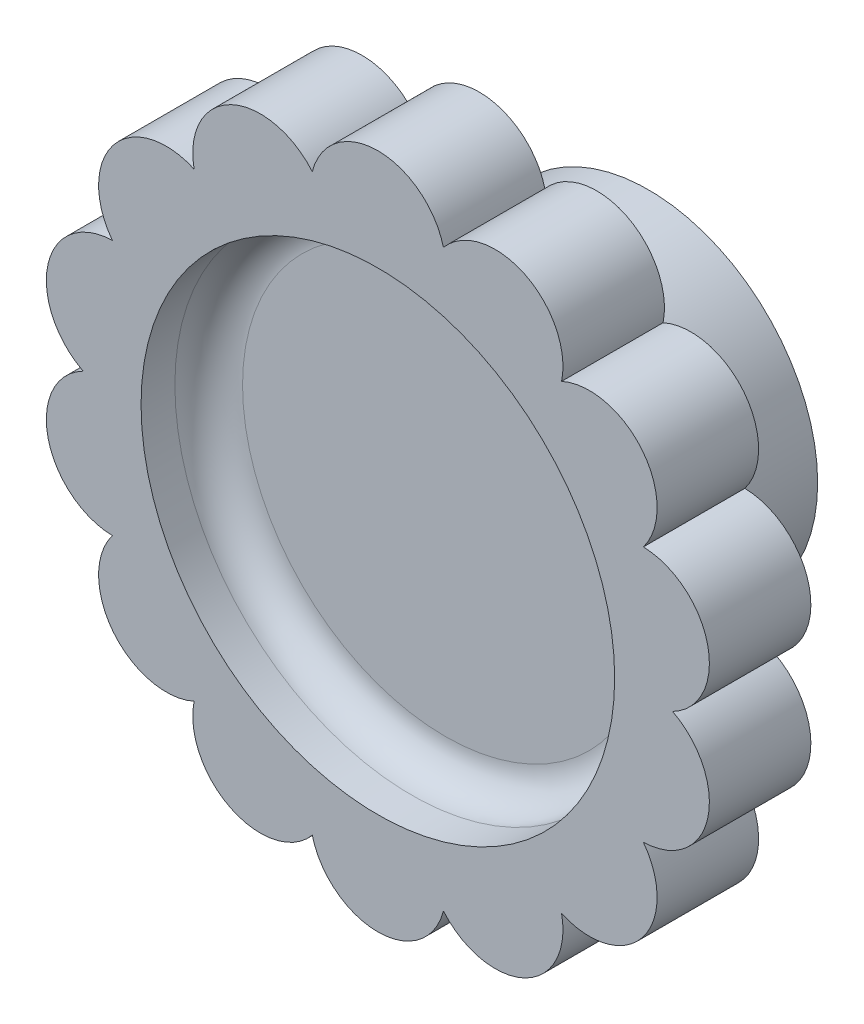
ISO-10303-21;
HEADER;
FILE_DESCRIPTION(('STEP AP214'),'2;1');
FILE_NAME('part.step','',(''),(''),'','','');
FILE_SCHEMA(('AUTOMOTIVE_DESIGN { 1 0 10303 214 1 1 1 1 }'));
ENDSEC;
DATA;
#1=APPLICATION_CONTEXT('core data for automotive mechanical design processes');
#2=APPLICATION_PROTOCOL_DEFINITION('international standard','automotive_design',2000,#1);
#3=PRODUCT_CONTEXT('',#1,'mechanical');
#4=PRODUCT('Part','Part','',(#3));
#5=PRODUCT_RELATED_PRODUCT_CATEGORY('part','',(#4));
#6=PRODUCT_DEFINITION_FORMATION('','',#4);
#7=PRODUCT_DEFINITION_CONTEXT('part definition',#1,'design');
#8=PRODUCT_DEFINITION('design','',#6,#7);
#9=PRODUCT_DEFINITION_SHAPE('','',#8);
#10=(LENGTH_UNIT() NAMED_UNIT(*) SI_UNIT(.MILLI.,.METRE.));
#11=(NAMED_UNIT(*) PLANE_ANGLE_UNIT() SI_UNIT($,.RADIAN.));
#12=(NAMED_UNIT(*) SI_UNIT($,.STERADIAN.) SOLID_ANGLE_UNIT());
#13=UNCERTAINTY_MEASURE_WITH_UNIT(LENGTH_MEASURE(1.E-05),#10,'distance_accuracy_value','');
#14=(GEOMETRIC_REPRESENTATION_CONTEXT(3) GLOBAL_UNCERTAINTY_ASSIGNED_CONTEXT((#13)) GLOBAL_UNIT_ASSIGNED_CONTEXT((#10,
#11,#12)) REPRESENTATION_CONTEXT('',''));
#15=CARTESIAN_POINT('',(0.,0.,0.));
#16=DIRECTION('',(0.,0.,1.));
#17=DIRECTION('',(1.,0.,0.));
#18=AXIS2_PLACEMENT_3D('',#15,#16,#17);
#19=CARTESIAN_POINT('',(0.,0.,0.));
#20=DIRECTION('',(0.,0.,1.));
#21=DIRECTION('',(1.,0.,0.));
#22=AXIS2_PLACEMENT_3D('',#19,#20,#21);
#23=PLANE('',#22);
#24=CARTESIAN_POINT('',(0.,0.,0.));
#25=DIRECTION('',(0.,0.,1.));
#26=DIRECTION('',(1.,0.,0.));
#27=AXIS2_PLACEMENT_3D('',#24,#25,#26);
#28=CIRCLE('',#27,10.);
#29=CARTESIAN_POINT('',(10.,0.,0.));
#30=VERTEX_POINT('',#29);
#31=EDGE_CURVE('E233',#30,#30,#28,.T.);
#32=ORIENTED_EDGE('',*,*,#31,.F.);
#33=EDGE_LOOP('',(#32));
#34=FACE_BOUND('',#33,.T.);
#35=CARTESIAN_POINT('',(0.,0.,0.));
#36=DIRECTION('',(0.,0.,1.));
#37=DIRECTION('',(1.,0.,0.));
#38=AXIS2_PLACEMENT_3D('',#35,#36,#37);
#39=CIRCLE('',#38,8.);
#40=CARTESIAN_POINT('',(8.,0.,0.));
#41=VERTEX_POINT('',#40);
#42=EDGE_CURVE('E230',#41,#41,#39,.T.);
#43=ORIENTED_EDGE('',*,*,#42,.T.);
#44=EDGE_LOOP('',(#43));
#45=FACE_BOUND('',#44,.T.);
#46=ADVANCED_FACE('F33',(#34,#45),#23,.F.);
#47=CARTESIAN_POINT('',(0.,0.,10.));
#48=DIRECTION('',(0.,0.,-1.));
#49=DIRECTION('',(-1.,0.,0.));
#50=AXIS2_PLACEMENT_3D('',#47,#48,#49);
#51=CYLINDRICAL_SURFACE('',#50,10.);
#52=CARTESIAN_POINT('',(0.,0.,10.));
#53=DIRECTION('',(0.,0.,1.));
#54=DIRECTION('',(1.,0.,0.));
#55=AXIS2_PLACEMENT_3D('',#52,#53,#54);
#56=CIRCLE('',#55,10.);
#57=CARTESIAN_POINT('',(10.,0.,10.));
#58=VERTEX_POINT('',#57);
#59=EDGE_CURVE('E234',#58,#58,#56,.T.);
#60=ORIENTED_EDGE('',*,*,#59,.F.);
#61=EDGE_LOOP('',(#60));
#62=FACE_BOUND('',#61,.T.);
#63=ORIENTED_EDGE('',*,*,#31,.T.);
#64=EDGE_LOOP('',(#63));
#65=FACE_BOUND('',#64,.T.);
#66=ADVANCED_FACE('F252',(#62,#65),#51,.T.);
#67=CARTESIAN_POINT('',(0.,0.,10.));
#68=DIRECTION('',(0.,0.,-1.));
#69=DIRECTION('',(-1.,0.,0.));
#70=AXIS2_PLACEMENT_3D('',#67,#68,#69);
#71=CYLINDRICAL_SURFACE('',#70,8.);
#72=CARTESIAN_POINT('',(0.,0.,10.));
#73=DIRECTION('',(0.,0.,1.));
#74=DIRECTION('',(1.,0.,0.));
#75=AXIS2_PLACEMENT_3D('',#72,#73,#74);
#76=CIRCLE('',#75,8.);
#77=CARTESIAN_POINT('',(8.,0.,10.));
#78=VERTEX_POINT('',#77);
#79=EDGE_CURVE('E227',#78,#78,#76,.T.);
#80=ORIENTED_EDGE('',*,*,#79,.T.);
#81=EDGE_LOOP('',(#80));
#82=FACE_BOUND('',#81,.T.);
#83=ORIENTED_EDGE('',*,*,#42,.F.);
#84=EDGE_LOOP('',(#83));
#85=FACE_BOUND('',#84,.T.);
#86=ADVANCED_FACE('F258',(#82,#85),#71,.F.);
#87=CARTESIAN_POINT('',(-9.72572177268423,12.1956693580884,10.));
#88=DIRECTION('',(0.,0.,1.));
#89=DIRECTION('',(1.,0.,0.));
#90=AXIS2_PLACEMENT_3D('',#87,#88,#89);
#91=PLANE('',#90);
#92=ORIENTED_EDGE('',*,*,#79,.F.);
#93=EDGE_LOOP('',(#92));
#94=FACE_BOUND('',#93,.T.);
#95=ADVANCED_FACE('F265',(#94),#91,.F.);
#96=CARTESIAN_POINT('',(-6.94213982588066,14.4155018864375,16.));
#97=DIRECTION('',(0.,0.,-1.));
#98=DIRECTION('',(-1.,0.,0.));
#99=AXIS2_PLACEMENT_3D('',#96,#97,#98);
#100=CYLINDRICAL_SURFACE('',#99,3.9999999999992);
#101=CARTESIAN_POINT('',(-6.94213982588066,14.4155018864375,10.));
#102=DIRECTION('',(0.,0.,1.));
#103=DIRECTION('',(1.,0.,0.));
#104=AXIS2_PLACEMENT_3D('',#101,#102,#103);
#105=CIRCLE('',#104,3.9999999999992);
#106=CARTESIAN_POINT('',(-3.87676744659127,16.9852279761766,10.));
#107=VERTEX_POINT('',#106);
#108=CARTESIAN_POINT('',(-10.862461001544,13.6210952653441,10.));
#109=VERTEX_POINT('',#108);
#110=EDGE_CURVE('E167',#107,#109,#105,.T.);
#111=ORIENTED_EDGE('',*,*,#110,.T.);
#112=DIRECTION('',(0.,0.,-1.));
#113=VECTOR('',#112,1.);
#114=CARTESIAN_POINT('',(-10.862461001544,13.6210952653441,16.));
#115=LINE('',#114,#113);
#116=CARTESIAN_POINT('',(-10.862461001544,13.6210952653441,16.));
#117=VERTEX_POINT('',#116);
#118=EDGE_CURVE('E225',#117,#109,#115,.T.);
#119=ORIENTED_EDGE('',*,*,#118,.F.);
#120=CARTESIAN_POINT('',(-6.94213982588066,14.4155018864375,16.));
#121=DIRECTION('',(0.,0.,1.));
#122=DIRECTION('',(1.,0.,0.));
#123=AXIS2_PLACEMENT_3D('',#120,#121,#122);
#124=CIRCLE('',#123,3.9999999999992);
#125=CARTESIAN_POINT('',(-3.87676744659127,16.9852279761766,16.));
#126=VERTEX_POINT('',#125);
#127=EDGE_CURVE('E194',#126,#117,#124,.T.);
#128=ORIENTED_EDGE('',*,*,#127,.F.);
#129=DIRECTION('',(0.,0.,-1.));
#130=VECTOR('',#129,1.);
#131=CARTESIAN_POINT('',(-3.87676744659127,16.9852279761766,16.));
#132=LINE('',#131,#130);
#133=EDGE_CURVE('E163',#126,#107,#132,.T.);
#134=ORIENTED_EDGE('',*,*,#133,.T.);
#135=EDGE_LOOP('',(#111,#119,#128,#134));
#136=FACE_BOUND('',#135,.T.);
#137=ADVANCED_FACE('F267',(#136),#100,.T.);
#138=CARTESIAN_POINT('',(-12.5093037194878,9.97583682973919,16.));
#139=DIRECTION('',(0.,0.,-1.));
#140=DIRECTION('',(-1.,0.,0.));
#141=AXIS2_PLACEMENT_3D('',#138,#139,#140);
#142=CYLINDRICAL_SURFACE('',#141,3.99999999999912);
#143=CARTESIAN_POINT('',(-12.5093037194878,9.97583682973919,10.));
#144=DIRECTION('',(0.,0.,1.));
#145=DIRECTION('',(1.,0.,0.));
#146=AXIS2_PLACEMENT_3D('',#143,#144,#145);
#147=CIRCLE('',#146,3.99999999999912);
#148=CARTESIAN_POINT('',(-15.6967109357992,7.55913758543947,10.));
#149=VERTEX_POINT('',#148);
#150=EDGE_CURVE('E170',#109,#149,#147,.T.);
#151=ORIENTED_EDGE('',*,*,#150,.T.);
#152=DIRECTION('',(0.,0.,-1.));
#153=VECTOR('',#152,1.);
#154=CARTESIAN_POINT('',(-15.6967109357992,7.55913758543947,16.));
#155=LINE('',#154,#153);
#156=CARTESIAN_POINT('',(-15.6967109357992,7.55913758543947,16.));
#157=VERTEX_POINT('',#156);
#158=EDGE_CURVE('E222',#157,#149,#155,.T.);
#159=ORIENTED_EDGE('',*,*,#158,.F.);
#160=CARTESIAN_POINT('',(-12.5093037194878,9.97583682973919,16.));
#161=DIRECTION('',(0.,0.,1.));
#162=DIRECTION('',(1.,0.,0.));
#163=AXIS2_PLACEMENT_3D('',#160,#161,#162);
#164=CIRCLE('',#163,3.99999999999912);
#165=EDGE_CURVE('E112',#117,#157,#164,.T.);
#166=ORIENTED_EDGE('',*,*,#165,.F.);
#167=ORIENTED_EDGE('',*,*,#118,.T.);
#168=EDGE_LOOP('',(#151,#159,#166,#167));
#169=FACE_BOUND('',#168,.T.);
#170=ADVANCED_FACE('F270',(#169),#142,.T.);
#171=CARTESIAN_POINT('',(-15.5988465949083,3.56033494330083,16.));
#172=DIRECTION('',(0.,0.,-1.));
#173=DIRECTION('',(-1.,0.,0.));
#174=AXIS2_PLACEMENT_3D('',#171,#172,#173);
#175=CYLINDRICAL_SURFACE('',#174,3.99999999999912);
#176=CARTESIAN_POINT('',(-15.5988465949083,3.56033494330083,10.));
#177=DIRECTION('',(0.,0.,1.));
#178=DIRECTION('',(1.,0.,0.));
#179=AXIS2_PLACEMENT_3D('',#176,#177,#178);
#180=CIRCLE('',#179,3.99999999999912);
#181=CARTESIAN_POINT('',(-17.4220347616931,0.,10.));
#182=VERTEX_POINT('',#181);
#183=EDGE_CURVE('E173',#149,#182,#180,.T.);
#184=ORIENTED_EDGE('',*,*,#183,.T.);
#185=DIRECTION('',(0.,0.,-1.));
#186=VECTOR('',#185,1.);
#187=CARTESIAN_POINT('',(-17.4220347616931,0.,16.));
#188=LINE('',#187,#186);
#189=CARTESIAN_POINT('',(-17.4220347616931,0.,16.));
#190=VERTEX_POINT('',#189);
#191=EDGE_CURVE('E219',#190,#182,#188,.T.);
#192=ORIENTED_EDGE('',*,*,#191,.F.);
#193=CARTESIAN_POINT('',(-15.5988465949083,3.56033494330083,16.));
#194=DIRECTION('',(0.,0.,1.));
#195=DIRECTION('',(1.,0.,0.));
#196=AXIS2_PLACEMENT_3D('',#193,#194,#195);
#197=CIRCLE('',#196,3.99999999999912);
#198=EDGE_CURVE('E335',#157,#190,#197,.T.);
#199=ORIENTED_EDGE('',*,*,#198,.F.);
#200=ORIENTED_EDGE('',*,*,#158,.T.);
#201=EDGE_LOOP('',(#184,#192,#199,#200));
#202=FACE_BOUND('',#201,.T.);
#203=ADVANCED_FACE('F274',(#202),#175,.T.);
#204=CARTESIAN_POINT('',(-15.5988465949083,-3.56033494330084,16.));
#205=DIRECTION('',(0.,0.,-1.));
#206=DIRECTION('',(-1.,0.,0.));
#207=AXIS2_PLACEMENT_3D('',#204,#205,#206);
#208=CYLINDRICAL_SURFACE('',#207,3.99999999999912);
#209=CARTESIAN_POINT('',(-15.5988465949083,-3.56033494330084,10.));
#210=DIRECTION('',(0.,0.,1.));
#211=DIRECTION('',(1.,0.,0.));
#212=AXIS2_PLACEMENT_3D('',#209,#210,#211);
#213=CIRCLE('',#212,3.99999999999912);
#214=CARTESIAN_POINT('',(-15.6967109357992,-7.55913758543948,10.));
#215=VERTEX_POINT('',#214);
#216=EDGE_CURVE('E175',#182,#215,#213,.T.);
#217=ORIENTED_EDGE('',*,*,#216,.T.);
#218=DIRECTION('',(0.,0.,-1.));
#219=VECTOR('',#218,1.);
#220=CARTESIAN_POINT('',(-15.6967109357992,-7.55913758543948,16.));
#221=LINE('',#220,#219);
#222=CARTESIAN_POINT('',(-15.6967109357992,-7.55913758543948,16.));
#223=VERTEX_POINT('',#222);
#224=EDGE_CURVE('E216',#223,#215,#221,.T.);
#225=ORIENTED_EDGE('',*,*,#224,.F.);
#226=CARTESIAN_POINT('',(-15.5988465949083,-3.56033494330084,16.));
#227=DIRECTION('',(0.,0.,1.));
#228=DIRECTION('',(1.,0.,0.));
#229=AXIS2_PLACEMENT_3D('',#226,#227,#228);
#230=CIRCLE('',#229,3.99999999999912);
#231=EDGE_CURVE('E337',#190,#223,#230,.T.);
#232=ORIENTED_EDGE('',*,*,#231,.F.);
#233=ORIENTED_EDGE('',*,*,#191,.T.);
#234=EDGE_LOOP('',(#217,#225,#232,#233));
#235=FACE_BOUND('',#234,.T.);
#236=ADVANCED_FACE('F277',(#235),#208,.T.);
#237=CARTESIAN_POINT('',(-12.5093037194878,-9.97583682973919,16.));
#238=DIRECTION('',(0.,0.,-1.));
#239=DIRECTION('',(-1.,0.,0.));
#240=AXIS2_PLACEMENT_3D('',#237,#238,#239);
#241=CYLINDRICAL_SURFACE('',#240,3.99999999999912);
#242=CARTESIAN_POINT('',(-12.5093037194878,-9.97583682973919,10.));
#243=DIRECTION('',(0.,0.,1.));
#244=DIRECTION('',(1.,0.,0.));
#245=AXIS2_PLACEMENT_3D('',#242,#243,#244);
#246=CIRCLE('',#245,3.99999999999912);
#247=CARTESIAN_POINT('',(-10.8624610015439,-13.621095265344,10.));
#248=VERTEX_POINT('',#247);
#249=EDGE_CURVE('E177',#215,#248,#246,.T.);
#250=ORIENTED_EDGE('',*,*,#249,.T.);
#251=DIRECTION('',(0.,0.,-1.));
#252=VECTOR('',#251,1.);
#253=CARTESIAN_POINT('',(-10.8624610015439,-13.621095265344,16.));
#254=LINE('',#253,#252);
#255=CARTESIAN_POINT('',(-10.8624610015439,-13.621095265344,16.));
#256=VERTEX_POINT('',#255);
#257=EDGE_CURVE('E213',#256,#248,#254,.T.);
#258=ORIENTED_EDGE('',*,*,#257,.F.);
#259=CARTESIAN_POINT('',(-12.5093037194878,-9.97583682973919,16.));
#260=DIRECTION('',(0.,0.,1.));
#261=DIRECTION('',(1.,0.,0.));
#262=AXIS2_PLACEMENT_3D('',#259,#260,#261);
#263=CIRCLE('',#262,3.99999999999912);
#264=EDGE_CURVE('E339',#223,#256,#263,.T.);
#265=ORIENTED_EDGE('',*,*,#264,.F.);
#266=ORIENTED_EDGE('',*,*,#224,.T.);
#267=EDGE_LOOP('',(#250,#258,#265,#266));
#268=FACE_BOUND('',#267,.T.);
#269=ADVANCED_FACE('F281',(#268),#241,.T.);
#270=CARTESIAN_POINT('',(-6.94213982588055,-14.4155018864379,16.));
#271=DIRECTION('',(0.,0.,-1.));
#272=DIRECTION('',(-1.,0.,0.));
#273=AXIS2_PLACEMENT_3D('',#270,#271,#272);
#274=CYLINDRICAL_SURFACE('',#273,3.99999999999903);
#275=CARTESIAN_POINT('',(-6.94213982588055,-14.4155018864379,10.));
#276=DIRECTION('',(0.,0.,1.));
#277=DIRECTION('',(1.,0.,0.));
#278=AXIS2_PLACEMENT_3D('',#275,#276,#277);
#279=CIRCLE('',#278,3.99999999999903);
#280=CARTESIAN_POINT('',(-3.87676744659127,-16.9852279761764,10.));
#281=VERTEX_POINT('',#280);
#282=EDGE_CURVE('E179',#248,#281,#279,.T.);
#283=ORIENTED_EDGE('',*,*,#282,.T.);
#284=DIRECTION('',(0.,0.,-1.));
#285=VECTOR('',#284,1.);
#286=CARTESIAN_POINT('',(-3.87676744659127,-16.9852279761764,16.));
#287=LINE('',#286,#285);
#288=CARTESIAN_POINT('',(-3.87676744659127,-16.9852279761764,16.));
#289=VERTEX_POINT('',#288);
#290=EDGE_CURVE('E210',#289,#281,#287,.T.);
#291=ORIENTED_EDGE('',*,*,#290,.F.);
#292=CARTESIAN_POINT('',(-6.94213982588055,-14.4155018864379,16.));
#293=DIRECTION('',(0.,0.,1.));
#294=DIRECTION('',(1.,0.,0.));
#295=AXIS2_PLACEMENT_3D('',#292,#293,#294);
#296=CIRCLE('',#295,3.99999999999903);
#297=EDGE_CURVE('E341',#256,#289,#296,.T.);
#298=ORIENTED_EDGE('',*,*,#297,.F.);
#299=ORIENTED_EDGE('',*,*,#257,.T.);
#300=EDGE_LOOP('',(#283,#291,#298,#299));
#301=FACE_BOUND('',#300,.T.);
#302=ADVANCED_FACE('F285',(#301),#274,.T.);
#303=CARTESIAN_POINT('',(0.,-15.9999999999991,16.));
#304=DIRECTION('',(0.,0.,-1.));
#305=DIRECTION('',(-1.,0.,0.));
#306=AXIS2_PLACEMENT_3D('',#303,#304,#305);
#307=CYLINDRICAL_SURFACE('',#306,3.999999999999);
#308=CARTESIAN_POINT('',(0.,-15.9999999999991,10.));
#309=DIRECTION('',(0.,0.,1.));
#310=DIRECTION('',(1.,0.,0.));
#311=AXIS2_PLACEMENT_3D('',#308,#309,#310);
#312=CIRCLE('',#311,3.999999999999);
#313=CARTESIAN_POINT('',(3.87676744659123,-16.9852279761765,10.));
#314=VERTEX_POINT('',#313);
#315=EDGE_CURVE('E181',#281,#314,#312,.T.);
#316=ORIENTED_EDGE('',*,*,#315,.T.);
#317=DIRECTION('',(0.,0.,-1.));
#318=VECTOR('',#317,1.);
#319=CARTESIAN_POINT('',(3.87676744659123,-16.9852279761765,16.));
#320=LINE('',#319,#318);
#321=CARTESIAN_POINT('',(3.87676744659123,-16.9852279761765,16.));
#322=VERTEX_POINT('',#321);
#323=EDGE_CURVE('E207',#322,#314,#320,.T.);
#324=ORIENTED_EDGE('',*,*,#323,.F.);
#325=CARTESIAN_POINT('',(0.,-15.9999999999991,16.));
#326=DIRECTION('',(0.,0.,1.));
#327=DIRECTION('',(1.,0.,0.));
#328=AXIS2_PLACEMENT_3D('',#325,#326,#327);
#329=CIRCLE('',#328,3.999999999999);
#330=EDGE_CURVE('E343',#289,#322,#329,.T.);
#331=ORIENTED_EDGE('',*,*,#330,.F.);
#332=ORIENTED_EDGE('',*,*,#290,.T.);
#333=EDGE_LOOP('',(#316,#324,#331,#332));
#334=FACE_BOUND('',#333,.T.);
#335=ADVANCED_FACE('F289',(#334),#307,.T.);
#336=CARTESIAN_POINT('',(6.94213982588055,-14.4155018864379,16.));
#337=DIRECTION('',(0.,0.,-1.));
#338=DIRECTION('',(-1.,0.,0.));
#339=AXIS2_PLACEMENT_3D('',#336,#337,#338);
#340=CYLINDRICAL_SURFACE('',#339,3.99999999999906);
#341=CARTESIAN_POINT('',(6.94213982588055,-14.4155018864379,10.));
#342=DIRECTION('',(0.,0.,1.));
#343=DIRECTION('',(1.,0.,0.));
#344=AXIS2_PLACEMENT_3D('',#341,#342,#343);
#345=CIRCLE('',#344,3.99999999999906);
#346=CARTESIAN_POINT('',(10.8624610015439,-13.6210952653438,10.));
#347=VERTEX_POINT('',#346);
#348=EDGE_CURVE('E183',#314,#347,#345,.T.);
#349=ORIENTED_EDGE('',*,*,#348,.T.);
#350=DIRECTION('',(0.,0.,-1.));
#351=VECTOR('',#350,1.);
#352=CARTESIAN_POINT('',(10.8624610015439,-13.6210952653438,16.));
#353=LINE('',#352,#351);
#354=CARTESIAN_POINT('',(10.8624610015439,-13.6210952653438,16.));
#355=VERTEX_POINT('',#354);
#356=EDGE_CURVE('E204',#355,#347,#353,.T.);
#357=ORIENTED_EDGE('',*,*,#356,.F.);
#358=CARTESIAN_POINT('',(6.94213982588055,-14.4155018864379,16.));
#359=DIRECTION('',(0.,0.,1.));
#360=DIRECTION('',(1.,0.,0.));
#361=AXIS2_PLACEMENT_3D('',#358,#359,#360);
#362=CIRCLE('',#361,3.99999999999906);
#363=EDGE_CURVE('E345',#322,#355,#362,.T.);
#364=ORIENTED_EDGE('',*,*,#363,.F.);
#365=ORIENTED_EDGE('',*,*,#323,.T.);
#366=EDGE_LOOP('',(#349,#357,#364,#365));
#367=FACE_BOUND('',#366,.T.);
#368=ADVANCED_FACE('F293',(#367),#340,.T.);
#369=CARTESIAN_POINT('',(12.5093037194878,-9.97583682973919,16.));
#370=DIRECTION('',(0.,0.,-1.));
#371=DIRECTION('',(-1.,0.,0.));
#372=AXIS2_PLACEMENT_3D('',#369,#370,#371);
#373=CYLINDRICAL_SURFACE('',#372,3.99999999999895);
#374=CARTESIAN_POINT('',(12.5093037194878,-9.97583682973919,10.));
#375=DIRECTION('',(0.,0.,1.));
#376=DIRECTION('',(1.,0.,0.));
#377=AXIS2_PLACEMENT_3D('',#374,#375,#376);
#378=CIRCLE('',#377,3.99999999999895);
#379=CARTESIAN_POINT('',(15.696710935799,-7.55913758543946,10.));
#380=VERTEX_POINT('',#379);
#381=EDGE_CURVE('E185',#347,#380,#378,.T.);
#382=ORIENTED_EDGE('',*,*,#381,.T.);
#383=DIRECTION('',(0.,0.,-1.));
#384=VECTOR('',#383,1.);
#385=CARTESIAN_POINT('',(15.696710935799,-7.55913758543946,16.));
#386=LINE('',#385,#384);
#387=CARTESIAN_POINT('',(15.696710935799,-7.55913758543946,16.));
#388=VERTEX_POINT('',#387);
#389=EDGE_CURVE('E201',#388,#380,#386,.T.);
#390=ORIENTED_EDGE('',*,*,#389,.F.);
#391=CARTESIAN_POINT('',(12.5093037194878,-9.97583682973919,16.));
#392=DIRECTION('',(0.,0.,1.));
#393=DIRECTION('',(1.,0.,0.));
#394=AXIS2_PLACEMENT_3D('',#391,#392,#393);
#395=CIRCLE('',#394,3.99999999999895);
#396=EDGE_CURVE('E347',#355,#388,#395,.T.);
#397=ORIENTED_EDGE('',*,*,#396,.F.);
#398=ORIENTED_EDGE('',*,*,#356,.T.);
#399=EDGE_LOOP('',(#382,#390,#397,#398));
#400=FACE_BOUND('',#399,.T.);
#401=ADVANCED_FACE('F297',(#400),#373,.T.);
#402=CARTESIAN_POINT('',(15.5988465949083,-3.56033494330083,16.));
#403=DIRECTION('',(0.,0.,-1.));
#404=DIRECTION('',(-1.,0.,0.));
#405=AXIS2_PLACEMENT_3D('',#402,#403,#404);
#406=CYLINDRICAL_SURFACE('',#405,3.99999999999912);
#407=CARTESIAN_POINT('',(15.5988465949083,-3.56033494330083,10.));
#408=DIRECTION('',(0.,0.,1.));
#409=DIRECTION('',(1.,0.,0.));
#410=AXIS2_PLACEMENT_3D('',#407,#408,#409);
#411=CIRCLE('',#410,3.99999999999912);
#412=CARTESIAN_POINT('',(17.4220347616931,0.,10.));
#413=VERTEX_POINT('',#412);
#414=EDGE_CURVE('E187',#380,#413,#411,.T.);
#415=ORIENTED_EDGE('',*,*,#414,.T.);
#416=DIRECTION('',(0.,0.,-1.));
#417=VECTOR('',#416,1.);
#418=CARTESIAN_POINT('',(17.4220347616931,0.,16.));
#419=LINE('',#418,#417);
#420=CARTESIAN_POINT('',(17.4220347616931,0.,16.));
#421=VERTEX_POINT('',#420);
#422=EDGE_CURVE('E198',#421,#413,#419,.T.);
#423=ORIENTED_EDGE('',*,*,#422,.F.);
#424=CARTESIAN_POINT('',(15.5988465949083,-3.56033494330083,16.));
#425=DIRECTION('',(0.,0.,1.));
#426=DIRECTION('',(1.,0.,0.));
#427=AXIS2_PLACEMENT_3D('',#424,#425,#426);
#428=CIRCLE('',#427,3.99999999999912);
#429=EDGE_CURVE('E349',#388,#421,#428,.T.);
#430=ORIENTED_EDGE('',*,*,#429,.F.);
#431=ORIENTED_EDGE('',*,*,#389,.T.);
#432=EDGE_LOOP('',(#415,#423,#430,#431));
#433=FACE_BOUND('',#432,.T.);
#434=ADVANCED_FACE('F301',(#433),#406,.T.);
#435=CARTESIAN_POINT('',(15.5988465949083,3.56033494330084,16.));
#436=DIRECTION('',(0.,0.,-1.));
#437=DIRECTION('',(-1.,0.,0.));
#438=AXIS2_PLACEMENT_3D('',#435,#436,#437);
#439=CYLINDRICAL_SURFACE('',#438,3.99999999999912);
#440=CARTESIAN_POINT('',(15.5988465949083,3.56033494330084,10.));
#441=DIRECTION('',(0.,0.,1.));
#442=DIRECTION('',(1.,0.,0.));
#443=AXIS2_PLACEMENT_3D('',#440,#441,#442);
#444=CIRCLE('',#443,3.99999999999912);
#445=CARTESIAN_POINT('',(15.6967109357993,7.55913758543948,10.));
#446=VERTEX_POINT('',#445);
#447=EDGE_CURVE('E189',#413,#446,#444,.T.);
#448=ORIENTED_EDGE('',*,*,#447,.T.);
#449=DIRECTION('',(0.,0.,-1.));
#450=VECTOR('',#449,1.);
#451=CARTESIAN_POINT('',(15.6967109357993,7.55913758543948,16.));
#452=LINE('',#451,#450);
#453=CARTESIAN_POINT('',(15.6967109357993,7.55913758543948,16.));
#454=VERTEX_POINT('',#453);
#455=EDGE_CURVE('E158',#454,#446,#452,.T.);
#456=ORIENTED_EDGE('',*,*,#455,.F.);
#457=CARTESIAN_POINT('',(15.5988465949083,3.56033494330084,16.));
#458=DIRECTION('',(0.,0.,1.));
#459=DIRECTION('',(1.,0.,0.));
#460=AXIS2_PLACEMENT_3D('',#457,#458,#459);
#461=CIRCLE('',#460,3.99999999999912);
#462=EDGE_CURVE('E149',#421,#454,#461,.T.);
#463=ORIENTED_EDGE('',*,*,#462,.F.);
#464=ORIENTED_EDGE('',*,*,#422,.T.);
#465=EDGE_LOOP('',(#448,#456,#463,#464));
#466=FACE_BOUND('',#465,.T.);
#467=ADVANCED_FACE('F305',(#466),#439,.T.);
#468=CARTESIAN_POINT('',(12.5093037194876,9.97583682973887,16.));
#469=DIRECTION('',(0.,0.,-1.));
#470=DIRECTION('',(-1.,0.,0.));
#471=AXIS2_PLACEMENT_3D('',#468,#469,#470);
#472=CYLINDRICAL_SURFACE('',#471,3.99999999999912);
#473=CARTESIAN_POINT('',(12.5093037194876,9.97583682973887,10.));
#474=DIRECTION('',(0.,0.,1.));
#475=DIRECTION('',(1.,0.,0.));
#476=AXIS2_PLACEMENT_3D('',#473,#474,#475);
#477=CIRCLE('',#476,3.99999999999912);
#478=CARTESIAN_POINT('',(10.8624610015439,13.6210952653438,10.));
#479=VERTEX_POINT('',#478);
#480=EDGE_CURVE('E157',#446,#479,#477,.T.);
#481=ORIENTED_EDGE('',*,*,#480,.T.);
#482=DIRECTION('',(0.,0.,-1.));
#483=VECTOR('',#482,1.);
#484=CARTESIAN_POINT('',(10.8624610015439,13.6210952653438,16.));
#485=LINE('',#484,#483);
#486=CARTESIAN_POINT('',(10.8624610015439,13.6210952653438,16.));
#487=VERTEX_POINT('',#486);
#488=EDGE_CURVE('E154',#487,#479,#485,.T.);
#489=ORIENTED_EDGE('',*,*,#488,.F.);
#490=CARTESIAN_POINT('',(12.5093037194876,9.97583682973887,16.));
#491=DIRECTION('',(0.,0.,1.));
#492=DIRECTION('',(1.,0.,0.));
#493=AXIS2_PLACEMENT_3D('',#490,#491,#492);
#494=CIRCLE('',#493,3.99999999999912);
#495=EDGE_CURVE('E143',#454,#487,#494,.T.);
#496=ORIENTED_EDGE('',*,*,#495,.F.);
#497=ORIENTED_EDGE('',*,*,#455,.T.);
#498=EDGE_LOOP('',(#481,#489,#496,#497));
#499=FACE_BOUND('',#498,.T.);
#500=ADVANCED_FACE('F155',(#499),#472,.T.);
#501=CARTESIAN_POINT('',(6.94213982588048,14.4155018864376,16.));
#502=DIRECTION('',(0.,0.,-1.));
#503=DIRECTION('',(-1.,0.,0.));
#504=AXIS2_PLACEMENT_3D('',#501,#502,#503);
#505=CYLINDRICAL_SURFACE('',#504,3.9999999999991);
#506=CARTESIAN_POINT('',(6.94213982588048,14.4155018864376,10.));
#507=DIRECTION('',(0.,0.,1.));
#508=DIRECTION('',(1.,0.,0.));
#509=AXIS2_PLACEMENT_3D('',#506,#507,#508);
#510=CIRCLE('',#509,3.9999999999991);
#511=CARTESIAN_POINT('',(3.8767674465913,16.9852279761763,10.));
#512=VERTEX_POINT('',#511);
#513=EDGE_CURVE('E97',#479,#512,#510,.T.);
#514=ORIENTED_EDGE('',*,*,#513,.T.);
#515=DIRECTION('',(0.,0.,-1.));
#516=VECTOR('',#515,1.);
#517=CARTESIAN_POINT('',(3.8767674465913,16.9852279761763,16.));
#518=LINE('',#517,#516);
#519=CARTESIAN_POINT('',(3.8767674465913,16.9852279761763,16.));
#520=VERTEX_POINT('',#519);
#521=EDGE_CURVE('E159',#520,#512,#518,.T.);
#522=ORIENTED_EDGE('',*,*,#521,.F.);
#523=CARTESIAN_POINT('',(6.94213982588048,14.4155018864376,16.));
#524=DIRECTION('',(0.,0.,1.));
#525=DIRECTION('',(1.,0.,0.));
#526=AXIS2_PLACEMENT_3D('',#523,#524,#525);
#527=CIRCLE('',#526,3.9999999999991);
#528=EDGE_CURVE('E147',#487,#520,#527,.T.);
#529=ORIENTED_EDGE('',*,*,#528,.F.);
#530=ORIENTED_EDGE('',*,*,#488,.T.);
#531=EDGE_LOOP('',(#514,#522,#529,#530));
#532=FACE_BOUND('',#531,.T.);
#533=ADVANCED_FACE('F161',(#532),#505,.T.);
#534=CARTESIAN_POINT('',(0.,15.9999999999988,16.));
#535=DIRECTION('',(0.,0.,-1.));
#536=DIRECTION('',(-1.,0.,0.));
#537=AXIS2_PLACEMENT_3D('',#534,#535,#536);
#538=CYLINDRICAL_SURFACE('',#537,3.99999999999914);
#539=CARTESIAN_POINT('',(0.,15.9999999999988,10.));
#540=DIRECTION('',(0.,0.,1.));
#541=DIRECTION('',(1.,0.,0.));
#542=AXIS2_PLACEMENT_3D('',#539,#540,#541);
#543=CIRCLE('',#542,3.99999999999914);
#544=EDGE_CURVE('E103',#512,#107,#543,.T.);
#545=ORIENTED_EDGE('',*,*,#544,.T.);
#546=ORIENTED_EDGE('',*,*,#133,.F.);
#547=CARTESIAN_POINT('',(0.,15.9999999999988,16.));
#548=DIRECTION('',(0.,0.,1.));
#549=DIRECTION('',(1.,0.,0.));
#550=AXIS2_PLACEMENT_3D('',#547,#548,#549);
#551=CIRCLE('',#550,3.99999999999914);
#552=EDGE_CURVE('E50',#520,#126,#551,.T.);
#553=ORIENTED_EDGE('',*,*,#552,.F.);
#554=ORIENTED_EDGE('',*,*,#521,.T.);
#555=EDGE_LOOP('',(#545,#546,#553,#554));
#556=FACE_BOUND('',#555,.T.);
#557=ADVANCED_FACE('F314',(#556),#538,.T.);
#558=CARTESIAN_POINT('',(-9.72572177268423,12.1956693580884,16.));
#559=DIRECTION('',(0.,0.,1.));
#560=DIRECTION('',(1.,0.,0.));
#561=AXIS2_PLACEMENT_3D('',#558,#559,#560);
#562=PLANE('',#561);
#563=CARTESIAN_POINT('',(0.,0.,16.));
#564=DIRECTION('',(0.,0.,1.));
#565=DIRECTION('',(1.,0.,0.));
#566=AXIS2_PLACEMENT_3D('',#563,#564,#565);
#567=CIRCLE('',#566,14.);
#568=CARTESIAN_POINT('',(14.,0.,16.));
#569=VERTEX_POINT('',#568);
#570=EDGE_CURVE('E171',#569,#569,#567,.T.);
#571=ORIENTED_EDGE('',*,*,#570,.F.);
#572=EDGE_LOOP('',(#571));
#573=FACE_BOUND('',#572,.T.);
#574=ORIENTED_EDGE('',*,*,#127,.T.);
#575=ORIENTED_EDGE('',*,*,#165,.T.);
#576=ORIENTED_EDGE('',*,*,#198,.T.);
#577=ORIENTED_EDGE('',*,*,#231,.T.);
#578=ORIENTED_EDGE('',*,*,#264,.T.);
#579=ORIENTED_EDGE('',*,*,#297,.T.);
#580=ORIENTED_EDGE('',*,*,#330,.T.);
#581=ORIENTED_EDGE('',*,*,#363,.T.);
#582=ORIENTED_EDGE('',*,*,#396,.T.);
#583=ORIENTED_EDGE('',*,*,#429,.T.);
#584=ORIENTED_EDGE('',*,*,#462,.T.);
#585=ORIENTED_EDGE('',*,*,#495,.T.);
#586=ORIENTED_EDGE('',*,*,#528,.T.);
#587=ORIENTED_EDGE('',*,*,#552,.T.);
#588=EDGE_LOOP('',(#574,#575,#576,#577,#578,#579,#580,#581,#582,#583,#584,#585,#586,#587));
#589=FACE_BOUND('',#588,.T.);
#590=ADVANCED_FACE('F145',(#573,#589),#562,.T.);
#591=ORIENTED_EDGE('',*,*,#59,.T.);
#592=EDGE_LOOP('',(#591));
#593=FACE_BOUND('',#592,.T.);
#594=ORIENTED_EDGE('',*,*,#110,.F.);
#595=ORIENTED_EDGE('',*,*,#544,.F.);
#596=ORIENTED_EDGE('',*,*,#513,.F.);
#597=ORIENTED_EDGE('',*,*,#480,.F.);
#598=ORIENTED_EDGE('',*,*,#447,.F.);
#599=ORIENTED_EDGE('',*,*,#414,.F.);
#600=ORIENTED_EDGE('',*,*,#381,.F.);
#601=ORIENTED_EDGE('',*,*,#348,.F.);
#602=ORIENTED_EDGE('',*,*,#315,.F.);
#603=ORIENTED_EDGE('',*,*,#282,.F.);
#604=ORIENTED_EDGE('',*,*,#249,.F.);
#605=ORIENTED_EDGE('',*,*,#216,.F.);
#606=ORIENTED_EDGE('',*,*,#183,.F.);
#607=ORIENTED_EDGE('',*,*,#150,.F.);
#608=EDGE_LOOP('',(#594,#595,#596,#597,#598,#599,#600,#601,#602,#603,#604,#605,#606,#607));
#609=FACE_BOUND('',#608,.T.);
#610=ADVANCED_FACE('F317',(#593,#609),#91,.F.);
#611=CARTESIAN_POINT('',(0.,0.,12.));
#612=DIRECTION('',(0.,0.,1.));
#613=DIRECTION('',(1.,0.,0.));
#614=AXIS2_PLACEMENT_3D('',#611,#612,#613);
#615=CYLINDRICAL_SURFACE('',#614,14.);
#616=CARTESIAN_POINT('',(0.,0.,14.));
#617=DIRECTION('',(0.,0.,1.));
#618=DIRECTION('',(1.,0.,0.));
#619=AXIS2_PLACEMENT_3D('',#616,#617,#618);
#620=CIRCLE('',#619,14.);
#621=CARTESIAN_POINT('',(14.,0.,14.));
#622=VERTEX_POINT('',#621);
#623=EDGE_CURVE('E11',#622,#622,#620,.F.);
#624=ORIENTED_EDGE('',*,*,#623,.T.);
#625=EDGE_LOOP('',(#624));
#626=FACE_BOUND('',#625,.T.);
#627=ORIENTED_EDGE('',*,*,#570,.T.);
#628=EDGE_LOOP('',(#627));
#629=FACE_BOUND('',#628,.T.);
#630=ADVANCED_FACE('F248',(#626,#629),#615,.F.);
#631=CARTESIAN_POINT('',(0.,0.,12.));
#632=DIRECTION('',(0.,0.,1.));
#633=DIRECTION('',(1.,0.,0.));
#634=AXIS2_PLACEMENT_3D('',#631,#632,#633);
#635=PLANE('',#634);
#636=CARTESIAN_POINT('',(0.,0.,12.));
#637=DIRECTION('',(0.,0.,1.));
#638=DIRECTION('',(1.,0.,0.));
#639=AXIS2_PLACEMENT_3D('',#636,#637,#638);
#640=CIRCLE('',#639,12.);
#641=CARTESIAN_POINT('',(12.,0.,12.));
#642=VERTEX_POINT('',#641);
#643=EDGE_CURVE('E42',#642,#642,#640,.T.);
#644=ORIENTED_EDGE('',*,*,#643,.T.);
#645=EDGE_LOOP('',(#644));
#646=FACE_BOUND('',#645,.T.);
#647=ADVANCED_FACE('F241',(#646),#635,.T.);
#648=CARTESIAN_POINT('',(0.,0.,14.));
#649=DIRECTION('',(0.,0.,1.));
#650=DIRECTION('',(1.,0.,0.));
#651=AXIS2_PLACEMENT_3D('',#648,#649,#650);
#652=TOROIDAL_SURFACE('',#651,12.,2.);
#653=ORIENTED_EDGE('',*,*,#623,.F.);
#654=EDGE_LOOP('',(#653));
#655=FACE_BOUND('',#654,.T.);
#656=ORIENTED_EDGE('',*,*,#643,.F.);
#657=EDGE_LOOP('',(#656));
#658=FACE_BOUND('',#657,.T.);
#659=ADVANCED_FACE('F35',(#655,#658),#652,.F.);
#660=CLOSED_SHELL('',(#46,#66,#86,#95,#137,#170,#203,#236,#269,#302,#335,#368,#401,#434,#467,
#500,#533,#557,#590,#610,#630,#647,#659));
#661=MANIFOLD_SOLID_BREP('B2',#660);
#662=ADVANCED_BREP_SHAPE_REPRESENTATION('',(#18,#661),#14);
#663=SHAPE_DEFINITION_REPRESENTATION(#9,#662);
ENDSEC;
END-ISO-10303-21;
